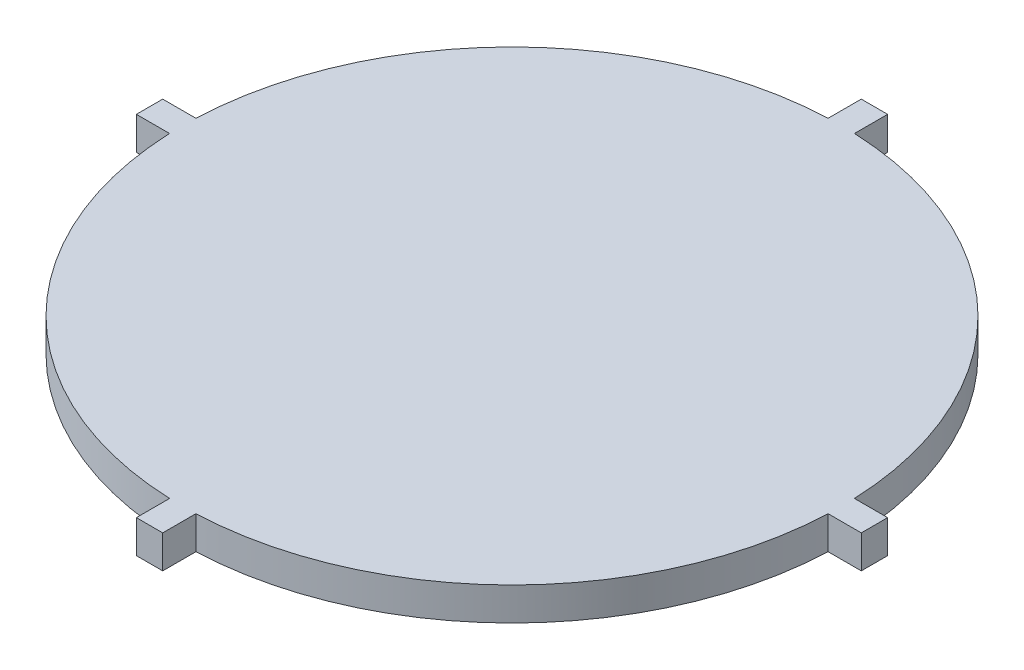
ISO-10303-21;
HEADER;
FILE_DESCRIPTION(('STEP AP214'),'2;1');
FILE_NAME('part.step','',(''),(''),'','','');
FILE_SCHEMA(('AUTOMOTIVE_DESIGN { 1 0 10303 214 1 1 1 1 }'));
ENDSEC;
DATA;
#1=APPLICATION_CONTEXT('core data for automotive mechanical design processes');
#2=APPLICATION_PROTOCOL_DEFINITION('international standard','automotive_design',2000,#1);
#3=PRODUCT_CONTEXT('',#1,'mechanical');
#4=PRODUCT('Part','Part','',(#3));
#5=PRODUCT_RELATED_PRODUCT_CATEGORY('part','',(#4));
#6=PRODUCT_DEFINITION_FORMATION('','',#4);
#7=PRODUCT_DEFINITION_CONTEXT('part definition',#1,'design');
#8=PRODUCT_DEFINITION('design','',#6,#7);
#9=PRODUCT_DEFINITION_SHAPE('','',#8);
#10=(LENGTH_UNIT() NAMED_UNIT(*) SI_UNIT(.MILLI.,.METRE.));
#11=(NAMED_UNIT(*) PLANE_ANGLE_UNIT() SI_UNIT($,.RADIAN.));
#12=(NAMED_UNIT(*) SI_UNIT($,.STERADIAN.) SOLID_ANGLE_UNIT());
#13=UNCERTAINTY_MEASURE_WITH_UNIT(LENGTH_MEASURE(1.E-05),#10,'distance_accuracy_value','');
#14=(GEOMETRIC_REPRESENTATION_CONTEXT(3) GLOBAL_UNCERTAINTY_ASSIGNED_CONTEXT((#13)) GLOBAL_UNIT_ASSIGNED_CONTEXT((#10,
#11,#12)) REPRESENTATION_CONTEXT('',''));
#15=CARTESIAN_POINT('',(0.,0.,0.));
#16=DIRECTION('',(0.,0.,1.));
#17=DIRECTION('',(1.,0.,0.));
#18=AXIS2_PLACEMENT_3D('',#15,#16,#17);
#19=CARTESIAN_POINT('',(0.,10.,-110.));
#20=DIRECTION('',(0.,0.,1.));
#21=DIRECTION('',(1.,0.,0.));
#22=AXIS2_PLACEMENT_3D('',#19,#20,#21);
#23=PLANE('',#22);
#24=DIRECTION('',(-1.,0.,0.));
#25=VECTOR('',#24,1.);
#26=CARTESIAN_POINT('',(0.,0.,-110.));
#27=LINE('',#26,#25);
#28=CARTESIAN_POINT('',(4.,0.,-110.));
#29=VERTEX_POINT('',#28);
#30=CARTESIAN_POINT('',(-4.00000000000898,0.,-110.));
#31=VERTEX_POINT('',#30);
#32=EDGE_CURVE('E113',#29,#31,#27,.T.);
#33=ORIENTED_EDGE('',*,*,#32,.T.);
#34=DIRECTION('',(0.,-1.,0.));
#35=VECTOR('',#34,1.);
#36=CARTESIAN_POINT('',(-4.00000000000898,10.,-110.));
#37=LINE('',#36,#35);
#38=CARTESIAN_POINT('',(-4.00000000000898,10.,-110.));
#39=VERTEX_POINT('',#38);
#40=EDGE_CURVE('E11',#39,#31,#37,.T.);
#41=ORIENTED_EDGE('',*,*,#40,.F.);
#42=DIRECTION('',(-1.,0.,0.));
#43=VECTOR('',#42,1.);
#44=CARTESIAN_POINT('',(0.,10.,-110.));
#45=LINE('',#44,#43);
#46=CARTESIAN_POINT('',(4.,10.,-110.));
#47=VERTEX_POINT('',#46);
#48=EDGE_CURVE('E119',#47,#39,#45,.T.);
#49=ORIENTED_EDGE('',*,*,#48,.F.);
#50=DIRECTION('',(0.,-1.,0.));
#51=VECTOR('',#50,1.);
#52=CARTESIAN_POINT('',(4.,10.,-110.));
#53=LINE('',#52,#51);
#54=EDGE_CURVE('E177',#47,#29,#53,.T.);
#55=ORIENTED_EDGE('',*,*,#54,.T.);
#56=EDGE_LOOP('',(#33,#41,#49,#55));
#57=FACE_BOUND('',#56,.T.);
#58=ADVANCED_FACE('F37',(#57),#23,.F.);
#59=CARTESIAN_POINT('',(-4.00000000000898,10.,-110.));
#60=DIRECTION('',(1.,0.,0.));
#61=DIRECTION('',(0.,0.,-1.));
#62=AXIS2_PLACEMENT_3D('',#59,#60,#61);
#63=PLANE('',#62);
#64=DIRECTION('',(0.,0.,1.));
#65=VECTOR('',#64,1.);
#66=CARTESIAN_POINT('',(-4.00000000000898,0.,-110.));
#67=LINE('',#66,#65);
#68=CARTESIAN_POINT('',(-4.00000000000898,0.,-99.9199679743698));
#69=VERTEX_POINT('',#68);
#70=EDGE_CURVE('E182',#31,#69,#67,.T.);
#71=ORIENTED_EDGE('',*,*,#70,.T.);
#72=DIRECTION('',(0.,-1.,0.));
#73=VECTOR('',#72,1.);
#74=CARTESIAN_POINT('',(-4.00000000000898,10.,-99.9199679743698));
#75=LINE('',#74,#73);
#76=CARTESIAN_POINT('',(-4.00000000000898,10.,-99.9199679743698));
#77=VERTEX_POINT('',#76);
#78=EDGE_CURVE('E45',#77,#69,#75,.T.);
#79=ORIENTED_EDGE('',*,*,#78,.F.);
#80=DIRECTION('',(0.,0.,1.));
#81=VECTOR('',#80,1.);
#82=CARTESIAN_POINT('',(-4.00000000000898,10.,-110.));
#83=LINE('',#82,#81);
#84=EDGE_CURVE('E299',#39,#77,#83,.T.);
#85=ORIENTED_EDGE('',*,*,#84,.F.);
#86=ORIENTED_EDGE('',*,*,#40,.T.);
#87=EDGE_LOOP('',(#71,#79,#85,#86));
#88=FACE_BOUND('',#87,.T.);
#89=ADVANCED_FACE('F302',(#88),#63,.F.);
#90=CARTESIAN_POINT('',(0.,10.,0.));
#91=DIRECTION('',(0.,-1.,0.));
#92=DIRECTION('',(0.,0.,-1.));
#93=AXIS2_PLACEMENT_3D('',#90,#91,#92);
#94=CYLINDRICAL_SURFACE('',#93,99.9999999999958);
#95=CARTESIAN_POINT('',(0.,0.,0.));
#96=DIRECTION('',(0.,1.,0.));
#97=DIRECTION('',(0.,0.,1.));
#98=AXIS2_PLACEMENT_3D('',#95,#96,#97);
#99=CIRCLE('',#98,99.9999999999958);
#100=CARTESIAN_POINT('',(-99.9199679743702,0.,-3.99999999999979));
#101=VERTEX_POINT('',#100);
#102=EDGE_CURVE('E184',#69,#101,#99,.T.);
#103=ORIENTED_EDGE('',*,*,#102,.T.);
#104=DIRECTION('',(0.,-1.,0.));
#105=VECTOR('',#104,1.);
#106=CARTESIAN_POINT('',(-99.9199679743702,10.,-3.99999999999979));
#107=LINE('',#106,#105);
#108=CARTESIAN_POINT('',(-99.9199679743702,10.,-3.99999999999979));
#109=VERTEX_POINT('',#108);
#110=EDGE_CURVE('E244',#109,#101,#107,.T.);
#111=ORIENTED_EDGE('',*,*,#110,.F.);
#112=CARTESIAN_POINT('',(0.,10.,0.));
#113=DIRECTION('',(0.,1.,0.));
#114=DIRECTION('',(0.,0.,1.));
#115=AXIS2_PLACEMENT_3D('',#112,#113,#114);
#116=CIRCLE('',#115,99.9999999999958);
#117=EDGE_CURVE('E253',#77,#109,#116,.T.);
#118=ORIENTED_EDGE('',*,*,#117,.F.);
#119=ORIENTED_EDGE('',*,*,#78,.T.);
#120=EDGE_LOOP('',(#103,#111,#118,#119));
#121=FACE_BOUND('',#120,.T.);
#122=ADVANCED_FACE('F251',(#121),#94,.T.);
#123=CARTESIAN_POINT('',(-110.,10.,-3.99999999999981));
#124=DIRECTION('',(0.,0.,1.));
#125=DIRECTION('',(1.,0.,0.));
#126=AXIS2_PLACEMENT_3D('',#123,#124,#125);
#127=PLANE('',#126);
#128=DIRECTION('',(-1.,0.,0.));
#129=VECTOR('',#128,1.);
#130=CARTESIAN_POINT('',(-110.,0.,-3.99999999999981));
#131=LINE('',#130,#129);
#132=CARTESIAN_POINT('',(-110.,0.,-3.99999999999981));
#133=VERTEX_POINT('',#132);
#134=EDGE_CURVE('E186',#101,#133,#131,.T.);
#135=ORIENTED_EDGE('',*,*,#134,.T.);
#136=DIRECTION('',(0.,-1.,0.));
#137=VECTOR('',#136,1.);
#138=CARTESIAN_POINT('',(-110.,10.,-3.99999999999981));
#139=LINE('',#138,#137);
#140=CARTESIAN_POINT('',(-110.,10.,-3.99999999999981));
#141=VERTEX_POINT('',#140);
#142=EDGE_CURVE('E241',#141,#133,#139,.T.);
#143=ORIENTED_EDGE('',*,*,#142,.F.);
#144=DIRECTION('',(-1.,0.,0.));
#145=VECTOR('',#144,1.);
#146=CARTESIAN_POINT('',(-110.,10.,-3.99999999999981));
#147=LINE('',#146,#145);
#148=EDGE_CURVE('E270',#109,#141,#147,.T.);
#149=ORIENTED_EDGE('',*,*,#148,.F.);
#150=ORIENTED_EDGE('',*,*,#110,.T.);
#151=EDGE_LOOP('',(#135,#143,#149,#150));
#152=FACE_BOUND('',#151,.T.);
#153=ADVANCED_FACE('F261',(#152),#127,.F.);
#154=CARTESIAN_POINT('',(-110.,10.,0.));
#155=DIRECTION('',(1.,0.,0.));
#156=DIRECTION('',(0.,0.,-1.));
#157=AXIS2_PLACEMENT_3D('',#154,#155,#156);
#158=PLANE('',#157);
#159=DIRECTION('',(0.,0.,1.));
#160=VECTOR('',#159,1.);
#161=CARTESIAN_POINT('',(-110.,0.,0.));
#162=LINE('',#161,#160);
#163=CARTESIAN_POINT('',(-110.,0.,4.000000000009));
#164=VERTEX_POINT('',#163);
#165=EDGE_CURVE('E189',#133,#164,#162,.T.);
#166=ORIENTED_EDGE('',*,*,#165,.T.);
#167=DIRECTION('',(0.,-1.,0.));
#168=VECTOR('',#167,1.);
#169=CARTESIAN_POINT('',(-110.,10.,4.000000000009));
#170=LINE('',#169,#168);
#171=CARTESIAN_POINT('',(-110.,10.,4.000000000009));
#172=VERTEX_POINT('',#171);
#173=EDGE_CURVE('E238',#172,#164,#170,.T.);
#174=ORIENTED_EDGE('',*,*,#173,.F.);
#175=DIRECTION('',(0.,0.,1.));
#176=VECTOR('',#175,1.);
#177=CARTESIAN_POINT('',(-110.,10.,0.));
#178=LINE('',#177,#176);
#179=EDGE_CURVE('E267',#141,#172,#178,.T.);
#180=ORIENTED_EDGE('',*,*,#179,.F.);
#181=ORIENTED_EDGE('',*,*,#142,.T.);
#182=EDGE_LOOP('',(#166,#174,#180,#181));
#183=FACE_BOUND('',#182,.T.);
#184=ADVANCED_FACE('F265',(#183),#158,.F.);
#185=CARTESIAN_POINT('',(-110.,10.,4.000000000009));
#186=DIRECTION('',(0.,0.,-1.));
#187=DIRECTION('',(-1.,0.,0.));
#188=AXIS2_PLACEMENT_3D('',#185,#186,#187);
#189=PLANE('',#188);
#190=DIRECTION('',(1.,0.,0.));
#191=VECTOR('',#190,1.);
#192=CARTESIAN_POINT('',(-110.,0.,4.000000000009));
#193=LINE('',#192,#191);
#194=CARTESIAN_POINT('',(-99.9199679743698,0.,4.000000000009));
#195=VERTEX_POINT('',#194);
#196=EDGE_CURVE('E191',#164,#195,#193,.T.);
#197=ORIENTED_EDGE('',*,*,#196,.T.);
#198=DIRECTION('',(0.,-1.,0.));
#199=VECTOR('',#198,1.);
#200=CARTESIAN_POINT('',(-99.9199679743698,10.,4.000000000009));
#201=LINE('',#200,#199);
#202=CARTESIAN_POINT('',(-99.9199679743698,10.,4.000000000009));
#203=VERTEX_POINT('',#202);
#204=EDGE_CURVE('E235',#203,#195,#201,.T.);
#205=ORIENTED_EDGE('',*,*,#204,.F.);
#206=DIRECTION('',(1.,0.,0.));
#207=VECTOR('',#206,1.);
#208=CARTESIAN_POINT('',(-110.,10.,4.000000000009));
#209=LINE('',#208,#207);
#210=EDGE_CURVE('E269',#172,#203,#209,.T.);
#211=ORIENTED_EDGE('',*,*,#210,.F.);
#212=ORIENTED_EDGE('',*,*,#173,.T.);
#213=EDGE_LOOP('',(#197,#205,#211,#212));
#214=FACE_BOUND('',#213,.T.);
#215=ADVANCED_FACE('F314',(#214),#189,.F.);
#216=CARTESIAN_POINT('',(0.,10.,0.));
#217=DIRECTION('',(0.,-1.,0.));
#218=DIRECTION('',(0.,0.,-1.));
#219=AXIS2_PLACEMENT_3D('',#216,#217,#218);
#220=CYLINDRICAL_SURFACE('',#219,99.9999999999958);
#221=CARTESIAN_POINT('',(0.,0.,0.));
#222=DIRECTION('',(0.,1.,0.));
#223=DIRECTION('',(0.,0.,1.));
#224=AXIS2_PLACEMENT_3D('',#221,#222,#223);
#225=CIRCLE('',#224,99.9999999999958);
#226=CARTESIAN_POINT('',(-3.99999999999988,0.,99.9199679743702));
#227=VERTEX_POINT('',#226);
#228=EDGE_CURVE('E193',#195,#227,#225,.T.);
#229=ORIENTED_EDGE('',*,*,#228,.T.);
#230=DIRECTION('',(0.,-1.,0.));
#231=VECTOR('',#230,1.);
#232=CARTESIAN_POINT('',(-3.99999999999988,10.,99.9199679743702));
#233=LINE('',#232,#231);
#234=CARTESIAN_POINT('',(-3.99999999999988,10.,99.9199679743702));
#235=VERTEX_POINT('',#234);
#236=EDGE_CURVE('E232',#235,#227,#233,.T.);
#237=ORIENTED_EDGE('',*,*,#236,.F.);
#238=CARTESIAN_POINT('',(0.,10.,0.));
#239=DIRECTION('',(0.,1.,0.));
#240=DIRECTION('',(0.,0.,1.));
#241=AXIS2_PLACEMENT_3D('',#238,#239,#240);
#242=CIRCLE('',#241,99.9999999999958);
#243=EDGE_CURVE('E272',#203,#235,#242,.T.);
#244=ORIENTED_EDGE('',*,*,#243,.F.);
#245=ORIENTED_EDGE('',*,*,#204,.T.);
#246=EDGE_LOOP('',(#229,#237,#244,#245));
#247=FACE_BOUND('',#246,.T.);
#248=ADVANCED_FACE('F317',(#247),#220,.T.);
#249=CARTESIAN_POINT('',(-3.99999999999982,10.,110.));
#250=DIRECTION('',(1.,0.,0.));
#251=DIRECTION('',(0.,0.,-1.));
#252=AXIS2_PLACEMENT_3D('',#249,#250,#251);
#253=PLANE('',#252);
#254=DIRECTION('',(0.,0.,1.));
#255=VECTOR('',#254,1.);
#256=CARTESIAN_POINT('',(-3.99999999999982,0.,110.));
#257=LINE('',#256,#255);
#258=CARTESIAN_POINT('',(-3.99999999999982,0.,110.));
#259=VERTEX_POINT('',#258);
#260=EDGE_CURVE('E195',#227,#259,#257,.T.);
#261=ORIENTED_EDGE('',*,*,#260,.T.);
#262=DIRECTION('',(0.,-1.,0.));
#263=VECTOR('',#262,1.);
#264=CARTESIAN_POINT('',(-3.99999999999982,10.,110.));
#265=LINE('',#264,#263);
#266=CARTESIAN_POINT('',(-3.99999999999982,10.,110.));
#267=VERTEX_POINT('',#266);
#268=EDGE_CURVE('E229',#267,#259,#265,.T.);
#269=ORIENTED_EDGE('',*,*,#268,.F.);
#270=DIRECTION('',(0.,0.,1.));
#271=VECTOR('',#270,1.);
#272=CARTESIAN_POINT('',(-3.99999999999982,10.,110.));
#273=LINE('',#272,#271);
#274=EDGE_CURVE('E278',#235,#267,#273,.T.);
#275=ORIENTED_EDGE('',*,*,#274,.F.);
#276=ORIENTED_EDGE('',*,*,#236,.T.);
#277=EDGE_LOOP('',(#261,#269,#275,#276));
#278=FACE_BOUND('',#277,.T.);
#279=ADVANCED_FACE('F321',(#278),#253,.F.);
#280=CARTESIAN_POINT('',(0.,10.,110.));
#281=DIRECTION('',(0.,0.,-1.));
#282=DIRECTION('',(-1.,0.,0.));
#283=AXIS2_PLACEMENT_3D('',#280,#281,#282);
#284=PLANE('',#283);
#285=DIRECTION('',(1.,0.,0.));
#286=VECTOR('',#285,1.);
#287=CARTESIAN_POINT('',(0.,0.,110.));
#288=LINE('',#287,#286);
#289=CARTESIAN_POINT('',(4.000000000009,0.,110.));
#290=VERTEX_POINT('',#289);
#291=EDGE_CURVE('E198',#259,#290,#288,.T.);
#292=ORIENTED_EDGE('',*,*,#291,.T.);
#293=DIRECTION('',(0.,-1.,0.));
#294=VECTOR('',#293,1.);
#295=CARTESIAN_POINT('',(4.000000000009,10.,110.));
#296=LINE('',#295,#294);
#297=CARTESIAN_POINT('',(4.000000000009,10.,110.));
#298=VERTEX_POINT('',#297);
#299=EDGE_CURVE('E226',#298,#290,#296,.T.);
#300=ORIENTED_EDGE('',*,*,#299,.F.);
#301=DIRECTION('',(1.,0.,0.));
#302=VECTOR('',#301,1.);
#303=CARTESIAN_POINT('',(-3.99999999999982,10.,110.));
#304=LINE('',#303,#302);
#305=EDGE_CURVE('E280',#267,#298,#304,.T.);
#306=ORIENTED_EDGE('',*,*,#305,.F.);
#307=ORIENTED_EDGE('',*,*,#268,.T.);
#308=EDGE_LOOP('',(#292,#300,#306,#307));
#309=FACE_BOUND('',#308,.T.);
#310=ADVANCED_FACE('F325',(#309),#284,.F.);
#311=CARTESIAN_POINT('',(4.000000000009,10.,110.));
#312=DIRECTION('',(-1.,0.,0.));
#313=DIRECTION('',(0.,0.,1.));
#314=AXIS2_PLACEMENT_3D('',#311,#312,#313);
#315=PLANE('',#314);
#316=DIRECTION('',(0.,0.,-1.));
#317=VECTOR('',#316,1.);
#318=CARTESIAN_POINT('',(4.000000000009,0.,110.));
#319=LINE('',#318,#317);
#320=CARTESIAN_POINT('',(4.00000000000899,0.,99.9199679743698));
#321=VERTEX_POINT('',#320);
#322=EDGE_CURVE('E200',#290,#321,#319,.T.);
#323=ORIENTED_EDGE('',*,*,#322,.T.);
#324=DIRECTION('',(0.,-1.,0.));
#325=VECTOR('',#324,1.);
#326=CARTESIAN_POINT('',(4.00000000000899,10.,99.9199679743698));
#327=LINE('',#326,#325);
#328=CARTESIAN_POINT('',(4.00000000000899,10.,99.9199679743698));
#329=VERTEX_POINT('',#328);
#330=EDGE_CURVE('E223',#329,#321,#327,.T.);
#331=ORIENTED_EDGE('',*,*,#330,.F.);
#332=DIRECTION('',(0.,0.,-1.));
#333=VECTOR('',#332,1.);
#334=CARTESIAN_POINT('',(4.000000000009,10.,110.));
#335=LINE('',#334,#333);
#336=EDGE_CURVE('E282',#298,#329,#335,.T.);
#337=ORIENTED_EDGE('',*,*,#336,.F.);
#338=ORIENTED_EDGE('',*,*,#299,.T.);
#339=EDGE_LOOP('',(#323,#331,#337,#338));
#340=FACE_BOUND('',#339,.T.);
#341=ADVANCED_FACE('F329',(#340),#315,.F.);
#342=CARTESIAN_POINT('',(0.,10.,0.));
#343=DIRECTION('',(0.,-1.,0.));
#344=DIRECTION('',(0.,0.,-1.));
#345=AXIS2_PLACEMENT_3D('',#342,#343,#344);
#346=CYLINDRICAL_SURFACE('',#345,99.9999999999958);
#347=CARTESIAN_POINT('',(0.,0.,0.));
#348=DIRECTION('',(0.,1.,0.));
#349=DIRECTION('',(0.,0.,1.));
#350=AXIS2_PLACEMENT_3D('',#347,#348,#349);
#351=CIRCLE('',#350,99.9999999999958);
#352=CARTESIAN_POINT('',(99.9199679743702,0.,3.99999999999982));
#353=VERTEX_POINT('',#352);
#354=EDGE_CURVE('E202',#321,#353,#351,.T.);
#355=ORIENTED_EDGE('',*,*,#354,.T.);
#356=DIRECTION('',(0.,-1.,0.));
#357=VECTOR('',#356,1.);
#358=CARTESIAN_POINT('',(99.9199679743702,10.,3.99999999999982));
#359=LINE('',#358,#357);
#360=CARTESIAN_POINT('',(99.9199679743702,10.,3.99999999999982));
#361=VERTEX_POINT('',#360);
#362=EDGE_CURVE('E220',#361,#353,#359,.T.);
#363=ORIENTED_EDGE('',*,*,#362,.F.);
#364=CARTESIAN_POINT('',(0.,10.,0.));
#365=DIRECTION('',(0.,1.,0.));
#366=DIRECTION('',(0.,0.,1.));
#367=AXIS2_PLACEMENT_3D('',#364,#365,#366);
#368=CIRCLE('',#367,99.9999999999958);
#369=EDGE_CURVE('E284',#329,#361,#368,.T.);
#370=ORIENTED_EDGE('',*,*,#369,.F.);
#371=ORIENTED_EDGE('',*,*,#330,.T.);
#372=EDGE_LOOP('',(#355,#363,#370,#371));
#373=FACE_BOUND('',#372,.T.);
#374=ADVANCED_FACE('F333',(#373),#346,.T.);
#375=CARTESIAN_POINT('',(110.,10.,3.99999999999983));
#376=DIRECTION('',(0.,0.,-1.));
#377=DIRECTION('',(-1.,0.,0.));
#378=AXIS2_PLACEMENT_3D('',#375,#376,#377);
#379=PLANE('',#378);
#380=DIRECTION('',(1.,0.,0.));
#381=VECTOR('',#380,1.);
#382=CARTESIAN_POINT('',(110.,0.,3.99999999999983));
#383=LINE('',#382,#381);
#384=CARTESIAN_POINT('',(110.,0.,3.99999999999983));
#385=VERTEX_POINT('',#384);
#386=EDGE_CURVE('E204',#353,#385,#383,.T.);
#387=ORIENTED_EDGE('',*,*,#386,.T.);
#388=DIRECTION('',(0.,-1.,0.));
#389=VECTOR('',#388,1.);
#390=CARTESIAN_POINT('',(110.,10.,3.99999999999983));
#391=LINE('',#390,#389);
#392=CARTESIAN_POINT('',(110.,10.,3.99999999999983));
#393=VERTEX_POINT('',#392);
#394=EDGE_CURVE('E217',#393,#385,#391,.T.);
#395=ORIENTED_EDGE('',*,*,#394,.F.);
#396=DIRECTION('',(1.,0.,0.));
#397=VECTOR('',#396,1.);
#398=CARTESIAN_POINT('',(110.,10.,3.99999999999983));
#399=LINE('',#398,#397);
#400=EDGE_CURVE('E286',#361,#393,#399,.T.);
#401=ORIENTED_EDGE('',*,*,#400,.F.);
#402=ORIENTED_EDGE('',*,*,#362,.T.);
#403=EDGE_LOOP('',(#387,#395,#401,#402));
#404=FACE_BOUND('',#403,.T.);
#405=ADVANCED_FACE('F292',(#404),#379,.F.);
#406=CARTESIAN_POINT('',(110.,10.,0.));
#407=DIRECTION('',(-1.,0.,0.));
#408=DIRECTION('',(0.,0.,1.));
#409=AXIS2_PLACEMENT_3D('',#406,#407,#408);
#410=PLANE('',#409);
#411=DIRECTION('',(0.,0.,-1.));
#412=VECTOR('',#411,1.);
#413=CARTESIAN_POINT('',(110.,0.,0.));
#414=LINE('',#413,#412);
#415=CARTESIAN_POINT('',(110.,0.,-4.00000000000899));
#416=VERTEX_POINT('',#415);
#417=EDGE_CURVE('E207',#385,#416,#414,.T.);
#418=ORIENTED_EDGE('',*,*,#417,.T.);
#419=DIRECTION('',(0.,-1.,0.));
#420=VECTOR('',#419,1.);
#421=CARTESIAN_POINT('',(110.,10.,-4.00000000000899));
#422=LINE('',#421,#420);
#423=CARTESIAN_POINT('',(110.,10.,-4.00000000000899));
#424=VERTEX_POINT('',#423);
#425=EDGE_CURVE('E172',#424,#416,#422,.T.);
#426=ORIENTED_EDGE('',*,*,#425,.F.);
#427=DIRECTION('',(0.,0.,-1.));
#428=VECTOR('',#427,1.);
#429=CARTESIAN_POINT('',(110.,10.,0.));
#430=LINE('',#429,#428);
#431=EDGE_CURVE('E163',#393,#424,#430,.T.);
#432=ORIENTED_EDGE('',*,*,#431,.F.);
#433=ORIENTED_EDGE('',*,*,#394,.T.);
#434=EDGE_LOOP('',(#418,#426,#432,#433));
#435=FACE_BOUND('',#434,.T.);
#436=ADVANCED_FACE('F295',(#435),#410,.F.);
#437=CARTESIAN_POINT('',(110.,10.,-4.00000000000899));
#438=DIRECTION('',(0.,0.,1.));
#439=DIRECTION('',(1.,0.,0.));
#440=AXIS2_PLACEMENT_3D('',#437,#438,#439);
#441=PLANE('',#440);
#442=DIRECTION('',(-1.,0.,0.));
#443=VECTOR('',#442,1.);
#444=CARTESIAN_POINT('',(110.,0.,-4.00000000000899));
#445=LINE('',#444,#443);
#446=CARTESIAN_POINT('',(99.9199679743698,0.,-4.00000000000899));
#447=VERTEX_POINT('',#446);
#448=EDGE_CURVE('E171',#416,#447,#445,.T.);
#449=ORIENTED_EDGE('',*,*,#448,.T.);
#450=DIRECTION('',(0.,-1.,0.));
#451=VECTOR('',#450,1.);
#452=CARTESIAN_POINT('',(99.9199679743698,10.,-4.00000000000899));
#453=LINE('',#452,#451);
#454=CARTESIAN_POINT('',(99.9199679743698,10.,-4.00000000000899));
#455=VERTEX_POINT('',#454);
#456=EDGE_CURVE('E168',#455,#447,#453,.T.);
#457=ORIENTED_EDGE('',*,*,#456,.F.);
#458=DIRECTION('',(-1.,0.,0.));
#459=VECTOR('',#458,1.);
#460=CARTESIAN_POINT('',(110.,10.,-4.00000000000899));
#461=LINE('',#460,#459);
#462=EDGE_CURVE('E157',#424,#455,#461,.T.);
#463=ORIENTED_EDGE('',*,*,#462,.F.);
#464=ORIENTED_EDGE('',*,*,#425,.T.);
#465=EDGE_LOOP('',(#449,#457,#463,#464));
#466=FACE_BOUND('',#465,.T.);
#467=ADVANCED_FACE('F169',(#466),#441,.F.);
#468=CARTESIAN_POINT('',(0.,10.,0.));
#469=DIRECTION('',(0.,-1.,0.));
#470=DIRECTION('',(0.,0.,-1.));
#471=AXIS2_PLACEMENT_3D('',#468,#469,#470);
#472=CYLINDRICAL_SURFACE('',#471,99.9999999999958);
#473=CARTESIAN_POINT('',(0.,0.,0.));
#474=DIRECTION('',(0.,1.,0.));
#475=DIRECTION('',(0.,0.,1.));
#476=AXIS2_PLACEMENT_3D('',#473,#474,#475);
#477=CIRCLE('',#476,99.9999999999958);
#478=CARTESIAN_POINT('',(3.99999999999983,0.,-99.9199679743702));
#479=VERTEX_POINT('',#478);
#480=EDGE_CURVE('E106',#447,#479,#477,.T.);
#481=ORIENTED_EDGE('',*,*,#480,.T.);
#482=DIRECTION('',(0.,-1.,0.));
#483=VECTOR('',#482,1.);
#484=CARTESIAN_POINT('',(3.99999999999983,10.,-99.9199679743702));
#485=LINE('',#484,#483);
#486=CARTESIAN_POINT('',(3.99999999999983,10.,-99.9199679743702));
#487=VERTEX_POINT('',#486);
#488=EDGE_CURVE('E173',#487,#479,#485,.T.);
#489=ORIENTED_EDGE('',*,*,#488,.F.);
#490=CARTESIAN_POINT('',(0.,10.,0.));
#491=DIRECTION('',(0.,1.,0.));
#492=DIRECTION('',(0.,0.,1.));
#493=AXIS2_PLACEMENT_3D('',#490,#491,#492);
#494=CIRCLE('',#493,99.9999999999958);
#495=EDGE_CURVE('E161',#455,#487,#494,.T.);
#496=ORIENTED_EDGE('',*,*,#495,.F.);
#497=ORIENTED_EDGE('',*,*,#456,.T.);
#498=EDGE_LOOP('',(#481,#489,#496,#497));
#499=FACE_BOUND('',#498,.T.);
#500=ADVANCED_FACE('F175',(#499),#472,.T.);
#501=CARTESIAN_POINT('',(4.,10.,-110.));
#502=DIRECTION('',(-1.,0.,0.));
#503=DIRECTION('',(0.,0.,1.));
#504=AXIS2_PLACEMENT_3D('',#501,#502,#503);
#505=PLANE('',#504);
#506=DIRECTION('',(0.,0.,-1.));
#507=VECTOR('',#506,1.);
#508=CARTESIAN_POINT('',(4.,0.,-110.));
#509=LINE('',#508,#507);
#510=EDGE_CURVE('E211',#479,#29,#509,.T.);
#511=ORIENTED_EDGE('',*,*,#510,.T.);
#512=ORIENTED_EDGE('',*,*,#54,.F.);
#513=DIRECTION('',(0.,0.,-1.));
#514=VECTOR('',#513,1.);
#515=CARTESIAN_POINT('',(4.,10.,-110.));
#516=LINE('',#515,#514);
#517=EDGE_CURVE('E53',#487,#47,#516,.T.);
#518=ORIENTED_EDGE('',*,*,#517,.F.);
#519=ORIENTED_EDGE('',*,*,#488,.T.);
#520=EDGE_LOOP('',(#511,#512,#518,#519));
#521=FACE_BOUND('',#520,.T.);
#522=ADVANCED_FACE('F297',(#521),#505,.F.);
#523=CARTESIAN_POINT('',(0.,10.,0.));
#524=DIRECTION('',(0.,1.,0.));
#525=DIRECTION('',(0.,0.,1.));
#526=AXIS2_PLACEMENT_3D('',#523,#524,#525);
#527=PLANE('',#526);
#528=ORIENTED_EDGE('',*,*,#48,.T.);
#529=ORIENTED_EDGE('',*,*,#84,.T.);
#530=ORIENTED_EDGE('',*,*,#117,.T.);
#531=ORIENTED_EDGE('',*,*,#148,.T.);
#532=ORIENTED_EDGE('',*,*,#179,.T.);
#533=ORIENTED_EDGE('',*,*,#210,.T.);
#534=ORIENTED_EDGE('',*,*,#243,.T.);
#535=ORIENTED_EDGE('',*,*,#274,.T.);
#536=ORIENTED_EDGE('',*,*,#305,.T.);
#537=ORIENTED_EDGE('',*,*,#336,.T.);
#538=ORIENTED_EDGE('',*,*,#369,.T.);
#539=ORIENTED_EDGE('',*,*,#400,.T.);
#540=ORIENTED_EDGE('',*,*,#431,.T.);
#541=ORIENTED_EDGE('',*,*,#462,.T.);
#542=ORIENTED_EDGE('',*,*,#495,.T.);
#543=ORIENTED_EDGE('',*,*,#517,.T.);
#544=EDGE_LOOP('',(#528,#529,#530,#531,#532,#533,#534,#535,#536,#537,#538,#539,#540,#541,#542,#543));
#545=FACE_BOUND('',#544,.T.);
#546=ADVANCED_FACE('F159',(#545),#527,.T.);
#547=CARTESIAN_POINT('',(0.,0.,0.));
#548=DIRECTION('',(0.,1.,0.));
#549=DIRECTION('',(0.,0.,1.));
#550=AXIS2_PLACEMENT_3D('',#547,#548,#549);
#551=PLANE('',#550);
#552=ORIENTED_EDGE('',*,*,#32,.F.);
#553=ORIENTED_EDGE('',*,*,#510,.F.);
#554=ORIENTED_EDGE('',*,*,#480,.F.);
#555=ORIENTED_EDGE('',*,*,#448,.F.);
#556=ORIENTED_EDGE('',*,*,#417,.F.);
#557=ORIENTED_EDGE('',*,*,#386,.F.);
#558=ORIENTED_EDGE('',*,*,#354,.F.);
#559=ORIENTED_EDGE('',*,*,#322,.F.);
#560=ORIENTED_EDGE('',*,*,#291,.F.);
#561=ORIENTED_EDGE('',*,*,#260,.F.);
#562=ORIENTED_EDGE('',*,*,#228,.F.);
#563=ORIENTED_EDGE('',*,*,#196,.F.);
#564=ORIENTED_EDGE('',*,*,#165,.F.);
#565=ORIENTED_EDGE('',*,*,#134,.F.);
#566=ORIENTED_EDGE('',*,*,#102,.F.);
#567=ORIENTED_EDGE('',*,*,#70,.F.);
#568=EDGE_LOOP('',(#552,#553,#554,#555,#556,#557,#558,#559,#560,#561,#562,#563,#564,#565,#566,#567));
#569=FACE_BOUND('',#568,.T.);
#570=ADVANCED_FACE('F257',(#569),#551,.F.);
#571=CLOSED_SHELL('',(#58,#89,#122,#153,#184,#215,#248,#279,#310,#341,#374,#405,#436,#467,#500,
#522,#546,#570));
#572=MANIFOLD_SOLID_BREP('B2',#571);
#573=ADVANCED_BREP_SHAPE_REPRESENTATION('',(#18,#572),#14);
#574=SHAPE_DEFINITION_REPRESENTATION(#9,#573);
ENDSEC;
END-ISO-10303-21;
